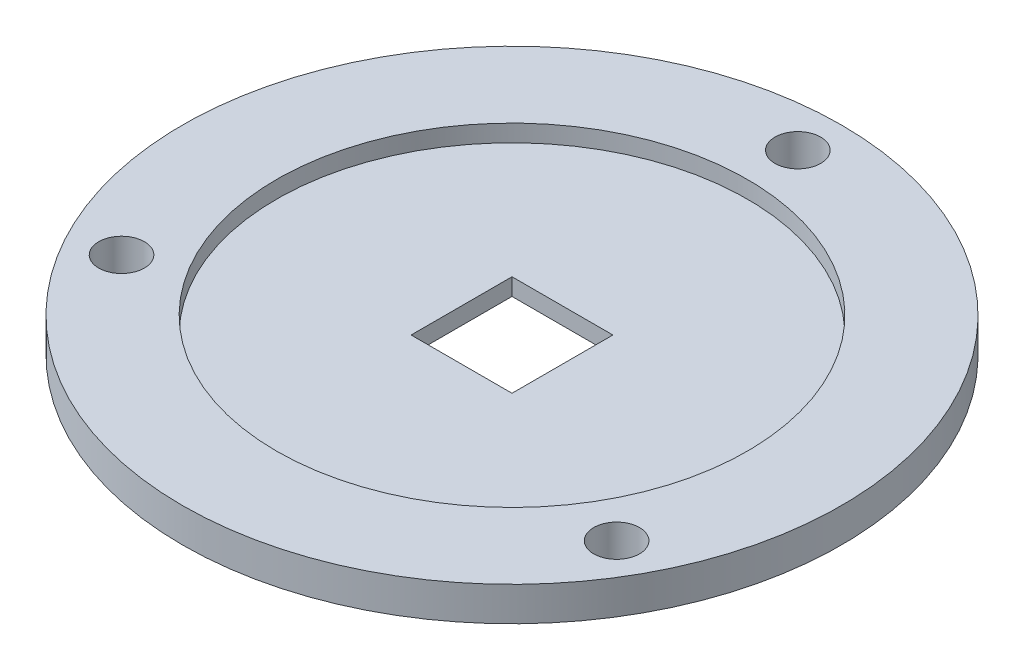
ISO-10303-21;
HEADER;
FILE_DESCRIPTION(('STEP AP214'),'2;1');
FILE_NAME('part.step','',(''),(''),'','','');
FILE_SCHEMA(('AUTOMOTIVE_DESIGN { 1 0 10303 214 1 1 1 1 }'));
ENDSEC;
DATA;
#1=APPLICATION_CONTEXT('core data for automotive mechanical design processes');
#2=APPLICATION_PROTOCOL_DEFINITION('international standard','automotive_design',2000,#1);
#3=PRODUCT_CONTEXT('',#1,'mechanical');
#4=PRODUCT('Part','Part','',(#3));
#5=PRODUCT_RELATED_PRODUCT_CATEGORY('part','',(#4));
#6=PRODUCT_DEFINITION_FORMATION('','',#4);
#7=PRODUCT_DEFINITION_CONTEXT('part definition',#1,'design');
#8=PRODUCT_DEFINITION('design','',#6,#7);
#9=PRODUCT_DEFINITION_SHAPE('','',#8);
#10=(LENGTH_UNIT() NAMED_UNIT(*) SI_UNIT(.MILLI.,.METRE.));
#11=(NAMED_UNIT(*) PLANE_ANGLE_UNIT() SI_UNIT($,.RADIAN.));
#12=(NAMED_UNIT(*) SI_UNIT($,.STERADIAN.) SOLID_ANGLE_UNIT());
#13=UNCERTAINTY_MEASURE_WITH_UNIT(LENGTH_MEASURE(1.E-05),#10,'distance_accuracy_value','');
#14=(GEOMETRIC_REPRESENTATION_CONTEXT(3) GLOBAL_UNCERTAINTY_ASSIGNED_CONTEXT((#13)) GLOBAL_UNIT_ASSIGNED_CONTEXT((#10,
#11,#12)) REPRESENTATION_CONTEXT('',''));
#15=CARTESIAN_POINT('',(0.,0.,0.));
#16=DIRECTION('',(0.,0.,1.));
#17=DIRECTION('',(1.,0.,0.));
#18=AXIS2_PLACEMENT_3D('',#15,#16,#17);
#19=CARTESIAN_POINT('',(0.,0.,0.));
#20=DIRECTION('',(0.,1.,0.));
#21=DIRECTION('',(0.,0.,1.));
#22=AXIS2_PLACEMENT_3D('',#19,#20,#21);
#23=PLANE('',#22);
#24=DIRECTION('',(1.,0.,0.));
#25=VECTOR('',#24,1.);
#26=CARTESIAN_POINT('',(-3.75,0.,-3.75));
#27=LINE('',#26,#25);
#28=CARTESIAN_POINT('',(-3.75,0.,-3.75));
#29=VERTEX_POINT('',#28);
#30=CARTESIAN_POINT('',(3.75,0.,-3.75));
#31=VERTEX_POINT('',#30);
#32=EDGE_CURVE('E211',#29,#31,#27,.T.);
#33=ORIENTED_EDGE('',*,*,#32,.F.);
#34=DIRECTION('',(0.,0.,-1.));
#35=VECTOR('',#34,1.);
#36=CARTESIAN_POINT('',(-3.75,0.,3.75));
#37=LINE('',#36,#35);
#38=CARTESIAN_POINT('',(-3.75,0.,3.75));
#39=VERTEX_POINT('',#38);
#40=EDGE_CURVE('E123',#39,#29,#37,.T.);
#41=ORIENTED_EDGE('',*,*,#40,.F.);
#42=DIRECTION('',(-1.,0.,0.));
#43=VECTOR('',#42,1.);
#44=CARTESIAN_POINT('',(-3.75,0.,3.75));
#45=LINE('',#44,#43);
#46=CARTESIAN_POINT('',(3.75,0.,3.75));
#47=VERTEX_POINT('',#46);
#48=EDGE_CURVE('E86',#47,#39,#45,.T.);
#49=ORIENTED_EDGE('',*,*,#48,.F.);
#50=DIRECTION('',(0.,0.,1.));
#51=VECTOR('',#50,1.);
#52=CARTESIAN_POINT('',(3.75,0.,3.75));
#53=LINE('',#52,#51);
#54=EDGE_CURVE('E114',#31,#47,#53,.T.);
#55=ORIENTED_EDGE('',*,*,#54,.F.);
#56=EDGE_LOOP('',(#33,#41,#49,#55));
#57=FACE_BOUND('',#56,.T.);
#58=CARTESIAN_POINT('',(-18.4030398304193,0.,10.6250000000001));
#59=DIRECTION('',(0.,1.,0.));
#60=DIRECTION('',(0.,0.,1.));
#61=AXIS2_PLACEMENT_3D('',#58,#59,#60);
#62=CIRCLE('',#61,1.7);
#63=CARTESIAN_POINT('',(-18.4030398304193,0.,12.3250000000001));
#64=VERTEX_POINT('',#63);
#65=EDGE_CURVE('E132',#64,#64,#62,.F.);
#66=ORIENTED_EDGE('',*,*,#65,.F.);
#67=EDGE_LOOP('',(#66));
#68=FACE_BOUND('',#67,.T.);
#69=CARTESIAN_POINT('',(0.,0.,-21.25));
#70=DIRECTION('',(0.,1.,0.));
#71=DIRECTION('',(0.,0.,1.));
#72=AXIS2_PLACEMENT_3D('',#69,#70,#71);
#73=CIRCLE('',#72,1.7);
#74=CARTESIAN_POINT('',(0.,0.,-19.55));
#75=VERTEX_POINT('',#74);
#76=EDGE_CURVE('E148',#75,#75,#73,.F.);
#77=ORIENTED_EDGE('',*,*,#76,.F.);
#78=EDGE_LOOP('',(#77));
#79=FACE_BOUND('',#78,.T.);
#80=CARTESIAN_POINT('',(0.,0.,0.));
#81=DIRECTION('',(0.,1.,0.));
#82=DIRECTION('',(0.,0.,1.));
#83=AXIS2_PLACEMENT_3D('',#80,#81,#82);
#84=CIRCLE('',#83,24.5);
#85=CARTESIAN_POINT('',(0.,0.,24.5));
#86=VERTEX_POINT('',#85);
#87=EDGE_CURVE('E43',#86,#86,#84,.T.);
#88=ORIENTED_EDGE('',*,*,#87,.F.);
#89=EDGE_LOOP('',(#88));
#90=FACE_BOUND('',#89,.T.);
#91=CARTESIAN_POINT('',(18.4030398304193,0.,10.6250000000001));
#92=DIRECTION('',(0.,1.,0.));
#93=DIRECTION('',(0.,0.,1.));
#94=AXIS2_PLACEMENT_3D('',#91,#92,#93);
#95=CIRCLE('',#94,1.7);
#96=CARTESIAN_POINT('',(18.4030398304193,0.,12.3250000000001));
#97=VERTEX_POINT('',#96);
#98=EDGE_CURVE('E140',#97,#97,#95,.F.);
#99=ORIENTED_EDGE('',*,*,#98,.F.);
#100=EDGE_LOOP('',(#99));
#101=FACE_BOUND('',#100,.T.);
#102=ADVANCED_FACE('F39',(#57,#68,#79,#90,#101),#23,.F.);
#103=CARTESIAN_POINT('',(0.,2.54,0.));
#104=DIRECTION('',(0.,-1.,0.));
#105=DIRECTION('',(0.,0.,-1.));
#106=AXIS2_PLACEMENT_3D('',#103,#104,#105);
#107=CYLINDRICAL_SURFACE('',#106,24.5);
#108=CARTESIAN_POINT('',(0.,2.54,0.));
#109=DIRECTION('',(0.,1.,0.));
#110=DIRECTION('',(0.,0.,1.));
#111=AXIS2_PLACEMENT_3D('',#108,#109,#110);
#112=CIRCLE('',#111,24.5);
#113=CARTESIAN_POINT('',(0.,2.54,24.5));
#114=VERTEX_POINT('',#113);
#115=EDGE_CURVE('E11',#114,#114,#112,.T.);
#116=ORIENTED_EDGE('',*,*,#115,.F.);
#117=EDGE_LOOP('',(#116));
#118=FACE_BOUND('',#117,.T.);
#119=ORIENTED_EDGE('',*,*,#87,.T.);
#120=EDGE_LOOP('',(#119));
#121=FACE_BOUND('',#120,.T.);
#122=ADVANCED_FACE('F41',(#118,#121),#107,.T.);
#123=CARTESIAN_POINT('',(0.,2.54,0.));
#124=DIRECTION('',(0.,1.,0.));
#125=DIRECTION('',(0.,0.,1.));
#126=AXIS2_PLACEMENT_3D('',#123,#124,#125);
#127=PLANE('',#126);
#128=CARTESIAN_POINT('',(0.,2.54,0.));
#129=DIRECTION('',(0.,1.,0.));
#130=DIRECTION('',(0.,0.,1.));
#131=AXIS2_PLACEMENT_3D('',#128,#129,#130);
#132=CIRCLE('',#131,17.5);
#133=CARTESIAN_POINT('',(0.,2.54,17.5));
#134=VERTEX_POINT('',#133);
#135=EDGE_CURVE('E122',#134,#134,#132,.T.);
#136=ORIENTED_EDGE('',*,*,#135,.F.);
#137=EDGE_LOOP('',(#136));
#138=FACE_BOUND('',#137,.T.);
#139=CARTESIAN_POINT('',(-18.4030398304193,2.54,10.6250000000001));
#140=DIRECTION('',(0.,1.,0.));
#141=DIRECTION('',(0.,0.,1.));
#142=AXIS2_PLACEMENT_3D('',#139,#140,#141);
#143=CIRCLE('',#142,1.7);
#144=CARTESIAN_POINT('',(-18.4030398304193,2.54,12.3250000000001));
#145=VERTEX_POINT('',#144);
#146=EDGE_CURVE('E128',#145,#145,#143,.T.);
#147=ORIENTED_EDGE('',*,*,#146,.F.);
#148=EDGE_LOOP('',(#147));
#149=FACE_BOUND('',#148,.T.);
#150=CARTESIAN_POINT('',(18.4030398304193,2.54,10.6250000000001));
#151=DIRECTION('',(0.,1.,0.));
#152=DIRECTION('',(0.,0.,1.));
#153=AXIS2_PLACEMENT_3D('',#150,#151,#152);
#154=CIRCLE('',#153,1.7);
#155=CARTESIAN_POINT('',(18.4030398304193,2.54,12.3250000000001));
#156=VERTEX_POINT('',#155);
#157=EDGE_CURVE('E136',#156,#156,#154,.T.);
#158=ORIENTED_EDGE('',*,*,#157,.F.);
#159=EDGE_LOOP('',(#158));
#160=FACE_BOUND('',#159,.T.);
#161=CARTESIAN_POINT('',(0.,2.54,-21.25));
#162=DIRECTION('',(0.,1.,0.));
#163=DIRECTION('',(0.,0.,1.));
#164=AXIS2_PLACEMENT_3D('',#161,#162,#163);
#165=CIRCLE('',#164,1.7);
#166=CARTESIAN_POINT('',(0.,2.54,-19.55));
#167=VERTEX_POINT('',#166);
#168=EDGE_CURVE('E144',#167,#167,#165,.T.);
#169=ORIENTED_EDGE('',*,*,#168,.F.);
#170=EDGE_LOOP('',(#169));
#171=FACE_BOUND('',#170,.T.);
#172=ORIENTED_EDGE('',*,*,#115,.T.);
#173=EDGE_LOOP('',(#172));
#174=FACE_BOUND('',#173,.T.);
#175=ADVANCED_FACE('F158',(#138,#149,#160,#171,#174),#127,.T.);
#176=CARTESIAN_POINT('',(0.,2.54,-21.25));
#177=DIRECTION('',(0.,1.,0.));
#178=DIRECTION('',(0.,0.,1.));
#179=AXIS2_PLACEMENT_3D('',#176,#177,#178);
#180=CYLINDRICAL_SURFACE('',#179,1.7);
#181=ORIENTED_EDGE('',*,*,#76,.T.);
#182=EDGE_LOOP('',(#181));
#183=FACE_BOUND('',#182,.T.);
#184=ORIENTED_EDGE('',*,*,#168,.T.);
#185=EDGE_LOOP('',(#184));
#186=FACE_BOUND('',#185,.T.);
#187=ADVANCED_FACE('F156',(#183,#186),#180,.F.);
#188=CARTESIAN_POINT('',(18.4030398304193,2.54,10.6250000000001));
#189=DIRECTION('',(0.,1.,0.));
#190=DIRECTION('',(0.,0.,1.));
#191=AXIS2_PLACEMENT_3D('',#188,#189,#190);
#192=CYLINDRICAL_SURFACE('',#191,1.7);
#193=ORIENTED_EDGE('',*,*,#98,.T.);
#194=EDGE_LOOP('',(#193));
#195=FACE_BOUND('',#194,.T.);
#196=ORIENTED_EDGE('',*,*,#157,.T.);
#197=EDGE_LOOP('',(#196));
#198=FACE_BOUND('',#197,.T.);
#199=ADVANCED_FACE('F176',(#195,#198),#192,.F.);
#200=CARTESIAN_POINT('',(-18.4030398304193,2.54,10.6250000000001));
#201=DIRECTION('',(0.,1.,0.));
#202=DIRECTION('',(0.,0.,1.));
#203=AXIS2_PLACEMENT_3D('',#200,#201,#202);
#204=CYLINDRICAL_SURFACE('',#203,1.7);
#205=ORIENTED_EDGE('',*,*,#65,.T.);
#206=EDGE_LOOP('',(#205));
#207=FACE_BOUND('',#206,.T.);
#208=ORIENTED_EDGE('',*,*,#146,.T.);
#209=EDGE_LOOP('',(#208));
#210=FACE_BOUND('',#209,.T.);
#211=ADVANCED_FACE('F179',(#207,#210),#204,.F.);
#212=CARTESIAN_POINT('',(0.,1.27,0.));
#213=DIRECTION('',(0.,1.,0.));
#214=DIRECTION('',(0.,0.,1.));
#215=AXIS2_PLACEMENT_3D('',#212,#213,#214);
#216=CYLINDRICAL_SURFACE('',#215,17.5);
#217=CARTESIAN_POINT('',(0.,1.27,0.));
#218=DIRECTION('',(0.,1.,0.));
#219=DIRECTION('',(0.,0.,1.));
#220=AXIS2_PLACEMENT_3D('',#217,#218,#219);
#221=CIRCLE('',#220,17.5);
#222=CARTESIAN_POINT('',(0.,1.27,17.5));
#223=VERTEX_POINT('',#222);
#224=EDGE_CURVE('E124',#223,#223,#221,.T.);
#225=ORIENTED_EDGE('',*,*,#224,.F.);
#226=EDGE_LOOP('',(#225));
#227=FACE_BOUND('',#226,.T.);
#228=ORIENTED_EDGE('',*,*,#135,.T.);
#229=EDGE_LOOP('',(#228));
#230=FACE_BOUND('',#229,.T.);
#231=ADVANCED_FACE('F187',(#227,#230),#216,.F.);
#232=CARTESIAN_POINT('',(0.,1.27,0.));
#233=DIRECTION('',(0.,1.,0.));
#234=DIRECTION('',(0.,0.,1.));
#235=AXIS2_PLACEMENT_3D('',#232,#233,#234);
#236=PLANE('',#235);
#237=DIRECTION('',(0.,0.,1.));
#238=VECTOR('',#237,1.);
#239=CARTESIAN_POINT('',(-3.75,1.27,3.75));
#240=LINE('',#239,#238);
#241=CARTESIAN_POINT('',(-3.75,1.27,-3.75));
#242=VERTEX_POINT('',#241);
#243=CARTESIAN_POINT('',(-3.75,1.27,3.75));
#244=VERTEX_POINT('',#243);
#245=EDGE_CURVE('E93',#242,#244,#240,.T.);
#246=ORIENTED_EDGE('',*,*,#245,.F.);
#247=DIRECTION('',(-1.,0.,0.));
#248=VECTOR('',#247,1.);
#249=CARTESIAN_POINT('',(-3.75,1.27,-3.75));
#250=LINE('',#249,#248);
#251=CARTESIAN_POINT('',(3.75,1.27,-3.75));
#252=VERTEX_POINT('',#251);
#253=EDGE_CURVE('E90',#252,#242,#250,.T.);
#254=ORIENTED_EDGE('',*,*,#253,.F.);
#255=DIRECTION('',(0.,0.,-1.));
#256=VECTOR('',#255,1.);
#257=CARTESIAN_POINT('',(3.75,1.27,3.75));
#258=LINE('',#257,#256);
#259=CARTESIAN_POINT('',(3.75,1.27,3.75));
#260=VERTEX_POINT('',#259);
#261=EDGE_CURVE('E55',#260,#252,#258,.T.);
#262=ORIENTED_EDGE('',*,*,#261,.F.);
#263=DIRECTION('',(1.,0.,0.));
#264=VECTOR('',#263,1.);
#265=CARTESIAN_POINT('',(-3.75,1.27,3.75));
#266=LINE('',#265,#264);
#267=EDGE_CURVE('E84',#244,#260,#266,.T.);
#268=ORIENTED_EDGE('',*,*,#267,.F.);
#269=EDGE_LOOP('',(#246,#254,#262,#268));
#270=FACE_BOUND('',#269,.T.);
#271=ORIENTED_EDGE('',*,*,#224,.T.);
#272=EDGE_LOOP('',(#271));
#273=FACE_BOUND('',#272,.T.);
#274=ADVANCED_FACE('F102',(#270,#273),#236,.T.);
#275=CARTESIAN_POINT('',(-3.75,-10.6066017177982,3.75));
#276=DIRECTION('',(-1.,0.,0.));
#277=DIRECTION('',(0.,0.,1.));
#278=AXIS2_PLACEMENT_3D('',#275,#276,#277);
#279=PLANE('',#278);
#280=ORIENTED_EDGE('',*,*,#40,.T.);
#281=DIRECTION('',(0.,1.,0.));
#282=VECTOR('',#281,1.);
#283=CARTESIAN_POINT('',(-3.75,-10.6066017177982,-3.75));
#284=LINE('',#283,#282);
#285=EDGE_CURVE('E96',#29,#242,#284,.T.);
#286=ORIENTED_EDGE('',*,*,#285,.T.);
#287=ORIENTED_EDGE('',*,*,#245,.T.);
#288=DIRECTION('',(0.,1.,0.));
#289=VECTOR('',#288,1.);
#290=CARTESIAN_POINT('',(-3.75,-10.6066017177982,3.75));
#291=LINE('',#290,#289);
#292=EDGE_CURVE('E80',#39,#244,#291,.T.);
#293=ORIENTED_EDGE('',*,*,#292,.F.);
#294=EDGE_LOOP('',(#280,#286,#287,#293));
#295=FACE_BOUND('',#294,.T.);
#296=ADVANCED_FACE('F94',(#295),#279,.F.);
#297=CARTESIAN_POINT('',(-3.75,-10.6066017177982,-3.75));
#298=DIRECTION('',(0.,0.,-1.));
#299=DIRECTION('',(-1.,0.,0.));
#300=AXIS2_PLACEMENT_3D('',#297,#298,#299);
#301=PLANE('',#300);
#302=ORIENTED_EDGE('',*,*,#32,.T.);
#303=DIRECTION('',(0.,1.,0.));
#304=VECTOR('',#303,1.);
#305=CARTESIAN_POINT('',(3.75,-10.6066017177982,-3.75));
#306=LINE('',#305,#304);
#307=EDGE_CURVE('E115',#31,#252,#306,.T.);
#308=ORIENTED_EDGE('',*,*,#307,.T.);
#309=ORIENTED_EDGE('',*,*,#253,.T.);
#310=ORIENTED_EDGE('',*,*,#285,.F.);
#311=EDGE_LOOP('',(#302,#308,#309,#310));
#312=FACE_BOUND('',#311,.T.);
#313=ADVANCED_FACE('F200',(#312),#301,.F.);
#314=CARTESIAN_POINT('',(3.75,-10.6066017177982,3.75));
#315=DIRECTION('',(1.,0.,0.));
#316=DIRECTION('',(0.,0.,-1.));
#317=AXIS2_PLACEMENT_3D('',#314,#315,#316);
#318=PLANE('',#317);
#319=ORIENTED_EDGE('',*,*,#54,.T.);
#320=DIRECTION('',(0.,1.,0.));
#321=VECTOR('',#320,1.);
#322=CARTESIAN_POINT('',(3.75,-10.6066017177982,3.75));
#323=LINE('',#322,#321);
#324=EDGE_CURVE('E62',#47,#260,#323,.T.);
#325=ORIENTED_EDGE('',*,*,#324,.T.);
#326=ORIENTED_EDGE('',*,*,#261,.T.);
#327=ORIENTED_EDGE('',*,*,#307,.F.);
#328=EDGE_LOOP('',(#319,#325,#326,#327));
#329=FACE_BOUND('',#328,.T.);
#330=ADVANCED_FACE('F203',(#329),#318,.F.);
#331=CARTESIAN_POINT('',(-3.75,-10.6066017177982,3.75));
#332=DIRECTION('',(0.,0.,1.));
#333=DIRECTION('',(1.,0.,0.));
#334=AXIS2_PLACEMENT_3D('',#331,#332,#333);
#335=PLANE('',#334);
#336=ORIENTED_EDGE('',*,*,#48,.T.);
#337=ORIENTED_EDGE('',*,*,#292,.T.);
#338=ORIENTED_EDGE('',*,*,#267,.T.);
#339=ORIENTED_EDGE('',*,*,#324,.F.);
#340=EDGE_LOOP('',(#336,#337,#338,#339));
#341=FACE_BOUND('',#340,.T.);
#342=ADVANCED_FACE('F82',(#341),#335,.F.);
#343=CLOSED_SHELL('',(#102,#122,#175,#187,#199,#211,#231,#274,#296,#313,#330,#342));
#344=MANIFOLD_SOLID_BREP('B2',#343);
#345=ADVANCED_BREP_SHAPE_REPRESENTATION('',(#18,#344),#14);
#346=SHAPE_DEFINITION_REPRESENTATION(#9,#345);
ENDSEC;
END-ISO-10303-21;
